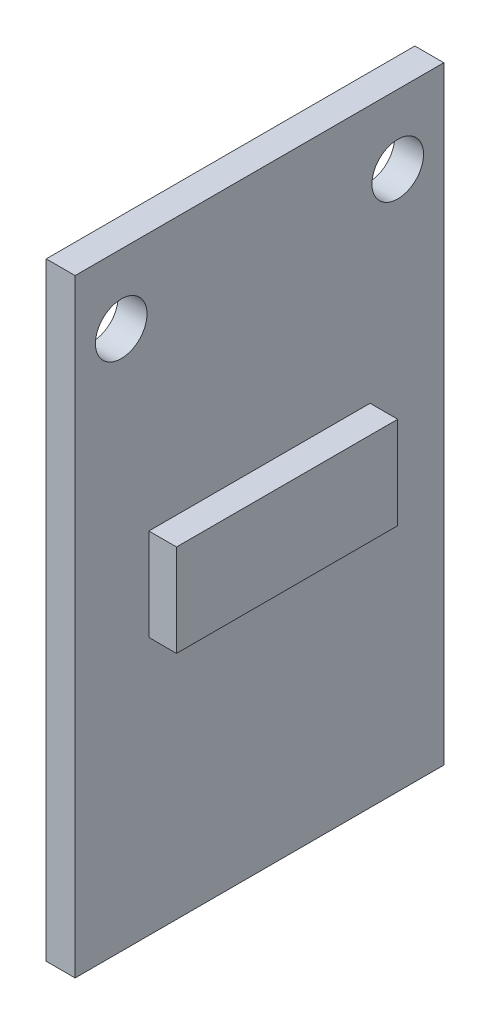
ISO-10303-21;
HEADER;
FILE_DESCRIPTION(('STEP AP214'),'2;1');
FILE_NAME('part.step','',(''),(''),'','','');
FILE_SCHEMA(('AUTOMOTIVE_DESIGN { 1 0 10303 214 1 1 1 1 }'));
ENDSEC;
DATA;
#1=APPLICATION_CONTEXT('core data for automotive mechanical design processes');
#2=APPLICATION_PROTOCOL_DEFINITION('international standard','automotive_design',2000,#1);
#3=PRODUCT_CONTEXT('',#1,'mechanical');
#4=PRODUCT('Part','Part','',(#3));
#5=PRODUCT_RELATED_PRODUCT_CATEGORY('part','',(#4));
#6=PRODUCT_DEFINITION_FORMATION('','',#4);
#7=PRODUCT_DEFINITION_CONTEXT('part definition',#1,'design');
#8=PRODUCT_DEFINITION('design','',#6,#7);
#9=PRODUCT_DEFINITION_SHAPE('','',#8);
#10=(LENGTH_UNIT() NAMED_UNIT(*) SI_UNIT(.MILLI.,.METRE.));
#11=(NAMED_UNIT(*) PLANE_ANGLE_UNIT() SI_UNIT($,.RADIAN.));
#12=(NAMED_UNIT(*) SI_UNIT($,.STERADIAN.) SOLID_ANGLE_UNIT());
#13=UNCERTAINTY_MEASURE_WITH_UNIT(LENGTH_MEASURE(1.E-05),#10,'distance_accuracy_value','');
#14=(GEOMETRIC_REPRESENTATION_CONTEXT(3) GLOBAL_UNCERTAINTY_ASSIGNED_CONTEXT((#13)) GLOBAL_UNIT_ASSIGNED_CONTEXT((#10,
#11,#12)) REPRESENTATION_CONTEXT('',''));
#15=CARTESIAN_POINT('',(0.,0.,0.));
#16=DIRECTION('',(0.,0.,1.));
#17=DIRECTION('',(1.,0.,0.));
#18=AXIS2_PLACEMENT_3D('',#15,#16,#17);
#19=CARTESIAN_POINT('',(1.57,0.,0.));
#20=DIRECTION('',(-1.,0.,0.));
#21=DIRECTION('',(0.,0.,1.));
#22=AXIS2_PLACEMENT_3D('',#19,#20,#21);
#23=PLANE('',#22);
#24=CARTESIAN_POINT('',(1.57,12.75,-7.5));
#25=DIRECTION('',(1.,0.,0.));
#26=DIRECTION('',(0.,0.,-1.));
#27=AXIS2_PLACEMENT_3D('',#24,#25,#26);
#28=CIRCLE('',#27,1.4);
#29=CARTESIAN_POINT('',(1.57,12.75,-8.9));
#30=VERTEX_POINT('',#29);
#31=EDGE_CURVE('E139',#30,#30,#28,.T.);
#32=ORIENTED_EDGE('',*,*,#31,.F.);
#33=EDGE_LOOP('',(#32));
#34=FACE_BOUND('',#33,.T.);
#35=CARTESIAN_POINT('',(1.57,12.75,7.5));
#36=DIRECTION('',(1.,0.,0.));
#37=DIRECTION('',(0.,0.,-1.));
#38=AXIS2_PLACEMENT_3D('',#35,#36,#37);
#39=CIRCLE('',#38,1.4);
#40=CARTESIAN_POINT('',(1.57,12.75,6.1));
#41=VERTEX_POINT('',#40);
#42=EDGE_CURVE('E149',#41,#41,#39,.T.);
#43=ORIENTED_EDGE('',*,*,#42,.F.);
#44=EDGE_LOOP('',(#43));
#45=FACE_BOUND('',#44,.T.);
#46=DIRECTION('',(0.,0.,1.));
#47=VECTOR('',#46,1.);
#48=CARTESIAN_POINT('',(1.57,16.5,-10.));
#49=LINE('',#48,#47);
#50=CARTESIAN_POINT('',(1.57,16.5,-10.));
#51=VERTEX_POINT('',#50);
#52=CARTESIAN_POINT('',(1.57,16.5,10.));
#53=VERTEX_POINT('',#52);
#54=EDGE_CURVE('E157',#51,#53,#49,.T.);
#55=ORIENTED_EDGE('',*,*,#54,.T.);
#56=DIRECTION('',(0.,-1.,0.));
#57=VECTOR('',#56,1.);
#58=CARTESIAN_POINT('',(1.57,-16.5,10.));
#59=LINE('',#58,#57);
#60=CARTESIAN_POINT('',(1.57,-16.5,10.));
#61=VERTEX_POINT('',#60);
#62=EDGE_CURVE('E161',#53,#61,#59,.T.);
#63=ORIENTED_EDGE('',*,*,#62,.T.);
#64=DIRECTION('',(0.,0.,-1.));
#65=VECTOR('',#64,1.);
#66=CARTESIAN_POINT('',(1.57,-16.5,-10.));
#67=LINE('',#66,#65);
#68=CARTESIAN_POINT('',(1.57,-16.5,-10.));
#69=VERTEX_POINT('',#68);
#70=EDGE_CURVE('E165',#61,#69,#67,.T.);
#71=ORIENTED_EDGE('',*,*,#70,.T.);
#72=DIRECTION('',(0.,1.,0.));
#73=VECTOR('',#72,1.);
#74=CARTESIAN_POINT('',(1.57,-16.5,-10.));
#75=LINE('',#74,#73);
#76=EDGE_CURVE('E168',#69,#51,#75,.T.);
#77=ORIENTED_EDGE('',*,*,#76,.T.);
#78=EDGE_LOOP('',(#55,#63,#71,#77));
#79=FACE_BOUND('',#78,.T.);
#80=DIRECTION('',(0.,0.,-1.));
#81=VECTOR('',#80,1.);
#82=CARTESIAN_POINT('',(1.57,-2.5,-6.));
#83=LINE('',#82,#81);
#84=CARTESIAN_POINT('',(1.57,-2.5,6.));
#85=VERTEX_POINT('',#84);
#86=CARTESIAN_POINT('',(1.57,-2.5,-6.));
#87=VERTEX_POINT('',#86);
#88=EDGE_CURVE('E61',#85,#87,#83,.T.);
#89=ORIENTED_EDGE('',*,*,#88,.F.);
#90=DIRECTION('',(0.,-1.,0.));
#91=VECTOR('',#90,1.);
#92=CARTESIAN_POINT('',(1.57,2.5,6.));
#93=LINE('',#92,#91);
#94=CARTESIAN_POINT('',(1.57,2.5,6.));
#95=VERTEX_POINT('',#94);
#96=EDGE_CURVE('E65',#95,#85,#93,.T.);
#97=ORIENTED_EDGE('',*,*,#96,.F.);
#98=DIRECTION('',(0.,0.,1.));
#99=VECTOR('',#98,1.);
#100=CARTESIAN_POINT('',(1.57,2.5,-6.));
#101=LINE('',#100,#99);
#102=CARTESIAN_POINT('',(1.57,2.5,-6.));
#103=VERTEX_POINT('',#102);
#104=EDGE_CURVE('E334',#103,#95,#101,.T.);
#105=ORIENTED_EDGE('',*,*,#104,.F.);
#106=DIRECTION('',(0.,1.,0.));
#107=VECTOR('',#106,1.);
#108=CARTESIAN_POINT('',(1.57,2.5,-6.));
#109=LINE('',#108,#107);
#110=EDGE_CURVE('E344',#87,#103,#109,.T.);
#111=ORIENTED_EDGE('',*,*,#110,.F.);
#112=EDGE_LOOP('',(#89,#97,#105,#111));
#113=FACE_BOUND('',#112,.T.);
#114=ADVANCED_FACE('F45',(#34,#45,#79,#113),#23,.F.);
#115=CARTESIAN_POINT('',(0.,0.,0.));
#116=DIRECTION('',(-1.,0.,0.));
#117=DIRECTION('',(0.,0.,1.));
#118=AXIS2_PLACEMENT_3D('',#115,#116,#117);
#119=PLANE('',#118);
#120=CARTESIAN_POINT('',(0.,12.75,7.5));
#121=DIRECTION('',(1.,0.,0.));
#122=DIRECTION('',(0.,0.,-1.));
#123=AXIS2_PLACEMENT_3D('',#120,#121,#122);
#124=CIRCLE('',#123,1.4);
#125=CARTESIAN_POINT('',(0.,12.75,6.1));
#126=VERTEX_POINT('',#125);
#127=EDGE_CURVE('E147',#126,#126,#124,.T.);
#128=ORIENTED_EDGE('',*,*,#127,.T.);
#129=EDGE_LOOP('',(#128));
#130=FACE_BOUND('',#129,.T.);
#131=DIRECTION('',(0.,0.,1.));
#132=VECTOR('',#131,1.);
#133=CARTESIAN_POINT('',(0.,16.5,-10.));
#134=LINE('',#133,#132);
#135=CARTESIAN_POINT('',(0.,16.5,-10.));
#136=VERTEX_POINT('',#135);
#137=CARTESIAN_POINT('',(0.,16.5,10.));
#138=VERTEX_POINT('',#137);
#139=EDGE_CURVE('E153',#136,#138,#134,.T.);
#140=ORIENTED_EDGE('',*,*,#139,.F.);
#141=DIRECTION('',(0.,1.,0.));
#142=VECTOR('',#141,1.);
#143=CARTESIAN_POINT('',(0.,-16.5,-10.));
#144=LINE('',#143,#142);
#145=CARTESIAN_POINT('',(0.,-16.5,-10.));
#146=VERTEX_POINT('',#145);
#147=EDGE_CURVE('E162',#146,#136,#144,.T.);
#148=ORIENTED_EDGE('',*,*,#147,.F.);
#149=DIRECTION('',(0.,0.,-1.));
#150=VECTOR('',#149,1.);
#151=CARTESIAN_POINT('',(0.,-16.5,-10.));
#152=LINE('',#151,#150);
#153=CARTESIAN_POINT('',(0.,-16.5,10.));
#154=VERTEX_POINT('',#153);
#155=EDGE_CURVE('E178',#154,#146,#152,.T.);
#156=ORIENTED_EDGE('',*,*,#155,.F.);
#157=DIRECTION('',(0.,-1.,0.));
#158=VECTOR('',#157,1.);
#159=CARTESIAN_POINT('',(0.,-16.5,10.));
#160=LINE('',#159,#158);
#161=EDGE_CURVE('E175',#138,#154,#160,.T.);
#162=ORIENTED_EDGE('',*,*,#161,.F.);
#163=EDGE_LOOP('',(#140,#148,#156,#162));
#164=FACE_BOUND('',#163,.T.);
#165=CARTESIAN_POINT('',(0.,12.75,-7.5));
#166=DIRECTION('',(1.,0.,0.));
#167=DIRECTION('',(0.,0.,-1.));
#168=AXIS2_PLACEMENT_3D('',#165,#166,#167);
#169=CIRCLE('',#168,1.4);
#170=CARTESIAN_POINT('',(0.,12.75,-8.9));
#171=VERTEX_POINT('',#170);
#172=EDGE_CURVE('E134',#171,#171,#169,.T.);
#173=ORIENTED_EDGE('',*,*,#172,.T.);
#174=EDGE_LOOP('',(#173));
#175=FACE_BOUND('',#174,.T.);
#176=ADVANCED_FACE('F201',(#130,#164,#175),#119,.T.);
#177=CARTESIAN_POINT('',(1.57,16.5,-10.));
#178=DIRECTION('',(0.,-1.,0.));
#179=DIRECTION('',(0.,0.,-1.));
#180=AXIS2_PLACEMENT_3D('',#177,#178,#179);
#181=PLANE('',#180);
#182=ORIENTED_EDGE('',*,*,#139,.T.);
#183=DIRECTION('',(-1.,0.,0.));
#184=VECTOR('',#183,1.);
#185=CARTESIAN_POINT('',(1.57,16.5,10.));
#186=LINE('',#185,#184);
#187=EDGE_CURVE('E11',#53,#138,#186,.T.);
#188=ORIENTED_EDGE('',*,*,#187,.F.);
#189=ORIENTED_EDGE('',*,*,#54,.F.);
#190=DIRECTION('',(-1.,0.,0.));
#191=VECTOR('',#190,1.);
#192=CARTESIAN_POINT('',(1.57,16.5,-10.));
#193=LINE('',#192,#191);
#194=EDGE_CURVE('E171',#51,#136,#193,.T.);
#195=ORIENTED_EDGE('',*,*,#194,.T.);
#196=EDGE_LOOP('',(#182,#188,#189,#195));
#197=FACE_BOUND('',#196,.T.);
#198=ADVANCED_FACE('F47',(#197),#181,.F.);
#199=CARTESIAN_POINT('',(1.57,-16.5,10.));
#200=DIRECTION('',(0.,0.,-1.));
#201=DIRECTION('',(-1.,0.,0.));
#202=AXIS2_PLACEMENT_3D('',#199,#200,#201);
#203=PLANE('',#202);
#204=ORIENTED_EDGE('',*,*,#161,.T.);
#205=DIRECTION('',(-1.,0.,0.));
#206=VECTOR('',#205,1.);
#207=CARTESIAN_POINT('',(1.57,-16.5,10.));
#208=LINE('',#207,#206);
#209=EDGE_CURVE('E54',#61,#154,#208,.T.);
#210=ORIENTED_EDGE('',*,*,#209,.F.);
#211=ORIENTED_EDGE('',*,*,#62,.F.);
#212=ORIENTED_EDGE('',*,*,#187,.T.);
#213=EDGE_LOOP('',(#204,#210,#211,#212));
#214=FACE_BOUND('',#213,.T.);
#215=ADVANCED_FACE('F211',(#214),#203,.F.);
#216=CARTESIAN_POINT('',(1.57,-16.5,-10.));
#217=DIRECTION('',(0.,1.,0.));
#218=DIRECTION('',(0.,0.,1.));
#219=AXIS2_PLACEMENT_3D('',#216,#217,#218);
#220=PLANE('',#219);
#221=ORIENTED_EDGE('',*,*,#155,.T.);
#222=DIRECTION('',(-1.,0.,0.));
#223=VECTOR('',#222,1.);
#224=CARTESIAN_POINT('',(1.57,-16.5,-10.));
#225=LINE('',#224,#223);
#226=EDGE_CURVE('E186',#69,#146,#225,.T.);
#227=ORIENTED_EDGE('',*,*,#226,.F.);
#228=ORIENTED_EDGE('',*,*,#70,.F.);
#229=ORIENTED_EDGE('',*,*,#209,.T.);
#230=EDGE_LOOP('',(#221,#227,#228,#229));
#231=FACE_BOUND('',#230,.T.);
#232=ADVANCED_FACE('F195',(#231),#220,.F.);
#233=CARTESIAN_POINT('',(1.57,-16.5,-10.));
#234=DIRECTION('',(0.,0.,1.));
#235=DIRECTION('',(1.,0.,0.));
#236=AXIS2_PLACEMENT_3D('',#233,#234,#235);
#237=PLANE('',#236);
#238=ORIENTED_EDGE('',*,*,#147,.T.);
#239=ORIENTED_EDGE('',*,*,#194,.F.);
#240=ORIENTED_EDGE('',*,*,#76,.F.);
#241=ORIENTED_EDGE('',*,*,#226,.T.);
#242=EDGE_LOOP('',(#238,#239,#240,#241));
#243=FACE_BOUND('',#242,.T.);
#244=ADVANCED_FACE('F205',(#243),#237,.F.);
#245=CARTESIAN_POINT('',(1.57,12.75,7.5));
#246=DIRECTION('',(-1.,0.,0.));
#247=DIRECTION('',(0.,0.,1.));
#248=AXIS2_PLACEMENT_3D('',#245,#246,#247);
#249=CYLINDRICAL_SURFACE('',#248,1.4);
#250=ORIENTED_EDGE('',*,*,#42,.T.);
#251=EDGE_LOOP('',(#250));
#252=FACE_BOUND('',#251,.T.);
#253=ORIENTED_EDGE('',*,*,#127,.F.);
#254=EDGE_LOOP('',(#253));
#255=FACE_BOUND('',#254,.T.);
#256=ADVANCED_FACE('F231',(#252,#255),#249,.F.);
#257=CARTESIAN_POINT('',(1.57,12.75,-7.5));
#258=DIRECTION('',(-1.,0.,0.));
#259=DIRECTION('',(0.,0.,1.));
#260=AXIS2_PLACEMENT_3D('',#257,#258,#259);
#261=CYLINDRICAL_SURFACE('',#260,1.4);
#262=ORIENTED_EDGE('',*,*,#31,.T.);
#263=EDGE_LOOP('',(#262));
#264=FACE_BOUND('',#263,.T.);
#265=ORIENTED_EDGE('',*,*,#172,.F.);
#266=EDGE_LOOP('',(#265));
#267=FACE_BOUND('',#266,.T.);
#268=ADVANCED_FACE('F238',(#264,#267),#261,.F.);
#269=CARTESIAN_POINT('',(3.07,-2.5,-6.));
#270=DIRECTION('',(0.,1.,0.));
#271=DIRECTION('',(0.,0.,1.));
#272=AXIS2_PLACEMENT_3D('',#269,#270,#271);
#273=PLANE('',#272);
#274=ORIENTED_EDGE('',*,*,#88,.T.);
#275=DIRECTION('',(-1.,0.,0.));
#276=VECTOR('',#275,1.);
#277=CARTESIAN_POINT('',(3.07,-2.5,-6.));
#278=LINE('',#277,#276);
#279=CARTESIAN_POINT('',(3.07,-2.5,-6.));
#280=VERTEX_POINT('',#279);
#281=EDGE_CURVE('E114',#280,#87,#278,.T.);
#282=ORIENTED_EDGE('',*,*,#281,.F.);
#283=DIRECTION('',(0.,0.,-1.));
#284=VECTOR('',#283,1.);
#285=CARTESIAN_POINT('',(3.07,-2.5,-6.));
#286=LINE('',#285,#284);
#287=CARTESIAN_POINT('',(3.07,-2.5,6.));
#288=VERTEX_POINT('',#287);
#289=EDGE_CURVE('E121',#288,#280,#286,.T.);
#290=ORIENTED_EDGE('',*,*,#289,.F.);
#291=DIRECTION('',(-1.,0.,0.));
#292=VECTOR('',#291,1.);
#293=CARTESIAN_POINT('',(3.07,-2.5,6.));
#294=LINE('',#293,#292);
#295=EDGE_CURVE('E331',#288,#85,#294,.T.);
#296=ORIENTED_EDGE('',*,*,#295,.T.);
#297=EDGE_LOOP('',(#274,#282,#290,#296));
#298=FACE_BOUND('',#297,.T.);
#299=ADVANCED_FACE('F132',(#298),#273,.F.);
#300=CARTESIAN_POINT('',(3.07,2.5,-6.));
#301=DIRECTION('',(0.,0.,1.));
#302=DIRECTION('',(0.,-1.,0.));
#303=AXIS2_PLACEMENT_3D('',#300,#301,#302);
#304=PLANE('',#303);
#305=ORIENTED_EDGE('',*,*,#110,.T.);
#306=DIRECTION('',(-1.,0.,0.));
#307=VECTOR('',#306,1.);
#308=CARTESIAN_POINT('',(3.07,2.5,-6.));
#309=LINE('',#308,#307);
#310=CARTESIAN_POINT('',(3.07,2.5,-6.));
#311=VERTEX_POINT('',#310);
#312=EDGE_CURVE('E116',#311,#103,#309,.T.);
#313=ORIENTED_EDGE('',*,*,#312,.F.);
#314=DIRECTION('',(0.,1.,0.));
#315=VECTOR('',#314,1.);
#316=CARTESIAN_POINT('',(3.07,2.5,-6.));
#317=LINE('',#316,#315);
#318=EDGE_CURVE('E109',#280,#311,#317,.T.);
#319=ORIENTED_EDGE('',*,*,#318,.F.);
#320=ORIENTED_EDGE('',*,*,#281,.T.);
#321=EDGE_LOOP('',(#305,#313,#319,#320));
#322=FACE_BOUND('',#321,.T.);
#323=ADVANCED_FACE('F112',(#322),#304,.F.);
#324=CARTESIAN_POINT('',(3.07,2.5,-6.));
#325=DIRECTION('',(0.,-1.,0.));
#326=DIRECTION('',(0.,0.,-1.));
#327=AXIS2_PLACEMENT_3D('',#324,#325,#326);
#328=PLANE('',#327);
#329=ORIENTED_EDGE('',*,*,#104,.T.);
#330=DIRECTION('',(-1.,0.,0.));
#331=VECTOR('',#330,1.);
#332=CARTESIAN_POINT('',(3.07,2.5,6.));
#333=LINE('',#332,#331);
#334=CARTESIAN_POINT('',(3.07,2.5,6.));
#335=VERTEX_POINT('',#334);
#336=EDGE_CURVE('E141',#335,#95,#333,.T.);
#337=ORIENTED_EDGE('',*,*,#336,.F.);
#338=DIRECTION('',(0.,0.,1.));
#339=VECTOR('',#338,1.);
#340=CARTESIAN_POINT('',(3.07,2.5,-6.));
#341=LINE('',#340,#339);
#342=EDGE_CURVE('E120',#311,#335,#341,.T.);
#343=ORIENTED_EDGE('',*,*,#342,.F.);
#344=ORIENTED_EDGE('',*,*,#312,.T.);
#345=EDGE_LOOP('',(#329,#337,#343,#344));
#346=FACE_BOUND('',#345,.T.);
#347=ADVANCED_FACE('F253',(#346),#328,.F.);
#348=CARTESIAN_POINT('',(3.07,2.5,6.));
#349=DIRECTION('',(0.,0.,-1.));
#350=DIRECTION('',(-1.,0.,0.));
#351=AXIS2_PLACEMENT_3D('',#348,#349,#350);
#352=PLANE('',#351);
#353=ORIENTED_EDGE('',*,*,#96,.T.);
#354=ORIENTED_EDGE('',*,*,#295,.F.);
#355=DIRECTION('',(0.,-1.,0.));
#356=VECTOR('',#355,1.);
#357=CARTESIAN_POINT('',(3.07,2.5,6.));
#358=LINE('',#357,#356);
#359=EDGE_CURVE('E126',#335,#288,#358,.T.);
#360=ORIENTED_EDGE('',*,*,#359,.F.);
#361=ORIENTED_EDGE('',*,*,#336,.T.);
#362=EDGE_LOOP('',(#353,#354,#360,#361));
#363=FACE_BOUND('',#362,.T.);
#364=ADVANCED_FACE('F256',(#363),#352,.F.);
#365=CARTESIAN_POINT('',(3.07,0.,0.));
#366=DIRECTION('',(1.,0.,0.));
#367=DIRECTION('',(0.,0.,-1.));
#368=AXIS2_PLACEMENT_3D('',#365,#366,#367);
#369=PLANE('',#368);
#370=ORIENTED_EDGE('',*,*,#289,.T.);
#371=ORIENTED_EDGE('',*,*,#318,.T.);
#372=ORIENTED_EDGE('',*,*,#342,.T.);
#373=ORIENTED_EDGE('',*,*,#359,.T.);
#374=EDGE_LOOP('',(#370,#371,#372,#373));
#375=FACE_BOUND('',#374,.T.);
#376=ADVANCED_FACE('F124',(#375),#369,.T.);
#377=CLOSED_SHELL('',(#114,#176,#198,#215,#232,#244,#256,#268,#299,#323,#347,#364,#376));
#378=MANIFOLD_SOLID_BREP('B2',#377);
#379=ADVANCED_BREP_SHAPE_REPRESENTATION('',(#18,#378),#14);
#380=SHAPE_DEFINITION_REPRESENTATION(#9,#379);
ENDSEC;
END-ISO-10303-21;
